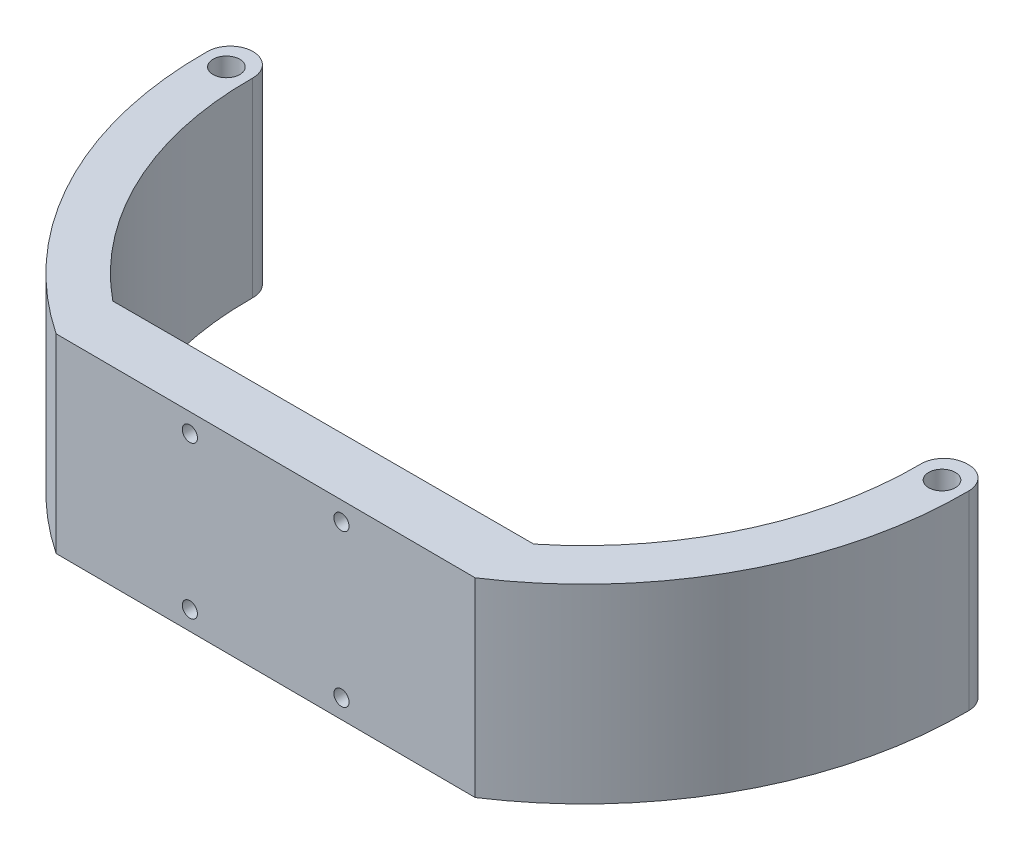
ISO-10303-21;
HEADER;
FILE_DESCRIPTION(('STEP AP214'),'2;1');
FILE_NAME('part.step','',(''),(''),'','','');
FILE_SCHEMA(('AUTOMOTIVE_DESIGN { 1 0 10303 214 1 1 1 1 }'));
ENDSEC;
DATA;
#1=APPLICATION_CONTEXT('core data for automotive mechanical design processes');
#2=APPLICATION_PROTOCOL_DEFINITION('international standard','automotive_design',2000,#1);
#3=PRODUCT_CONTEXT('',#1,'mechanical');
#4=PRODUCT('Part','Part','',(#3));
#5=PRODUCT_RELATED_PRODUCT_CATEGORY('part','',(#4));
#6=PRODUCT_DEFINITION_FORMATION('','',#4);
#7=PRODUCT_DEFINITION_CONTEXT('part definition',#1,'design');
#8=PRODUCT_DEFINITION('design','',#6,#7);
#9=PRODUCT_DEFINITION_SHAPE('','',#8);
#10=(LENGTH_UNIT() NAMED_UNIT(*) SI_UNIT(.MILLI.,.METRE.));
#11=(NAMED_UNIT(*) PLANE_ANGLE_UNIT() SI_UNIT($,.RADIAN.));
#12=(NAMED_UNIT(*) SI_UNIT($,.STERADIAN.) SOLID_ANGLE_UNIT());
#13=UNCERTAINTY_MEASURE_WITH_UNIT(LENGTH_MEASURE(1.E-05),#10,'distance_accuracy_value','');
#14=(GEOMETRIC_REPRESENTATION_CONTEXT(3) GLOBAL_UNCERTAINTY_ASSIGNED_CONTEXT((#13)) GLOBAL_UNIT_ASSIGNED_CONTEXT((#10,
#11,#12)) REPRESENTATION_CONTEXT('',''));
#15=CARTESIAN_POINT('',(0.,0.,0.));
#16=DIRECTION('',(0.,0.,1.));
#17=DIRECTION('',(1.,0.,0.));
#18=AXIS2_PLACEMENT_3D('',#15,#16,#17);
#19=CARTESIAN_POINT('',(0.,25.,0.));
#20=DIRECTION('',(0.,-1.,0.));
#21=DIRECTION('',(0.,0.,-1.));
#22=AXIS2_PLACEMENT_3D('',#19,#20,#21);
#23=PLANE('',#22);
#24=CARTESIAN_POINT('',(-47.0061393256436,25.,-0.495695011252922));
#25=DIRECTION('',(0.,-1.,0.));
#26=DIRECTION('',(0.,0.,-1.));
#27=AXIS2_PLACEMENT_3D('',#24,#25,#26);
#28=CIRCLE('',#27,3.);
#29=CARTESIAN_POINT('',(-44.0063061175485,25.,-0.46406079544247));
#30=VERTEX_POINT('',#29);
#31=CARTESIAN_POINT('',(-46.7528286740868,25.,-3.48498150033487));
#32=VERTEX_POINT('',#31);
#33=EDGE_CURVE('E214',#30,#32,#28,.F.);
#34=ORIENTED_EDGE('',*,*,#33,.T.);
#35=CARTESIAN_POINT('',(-46.9973936285744,25.,-0.494966787488694));
#36=DIRECTION('',(0.,-1.,0.));
#37=DIRECTION('',(0.,0.,-1.));
#38=AXIS2_PLACEMENT_3D('',#35,#36,#37);
#39=CIRCLE('',#38,3.);
#40=CARTESIAN_POINT('',(-49.997227264441,25.,-0.526560412222016));
#41=VERTEX_POINT('',#40);
#42=EDGE_CURVE('E11',#32,#41,#39,.F.);
#43=ORIENTED_EDGE('',*,*,#42,.T.);
#44=CARTESIAN_POINT('',(0.,25.,0.));
#45=DIRECTION('',(0.,1.,0.));
#46=DIRECTION('',(0.,0.,-1.));
#47=AXIS2_PLACEMENT_3D('',#44,#45,#46);
#48=CIRCLE('',#47,49.9999999999988);
#49=CARTESIAN_POINT('',(-27.8216921947987,25.,41.5445958389025));
#50=VERTEX_POINT('',#49);
#51=EDGE_CURVE('E120',#41,#50,#48,.T.);
#52=ORIENTED_EDGE('',*,*,#51,.T.);
#53=DIRECTION('',(0.999990762966052,0.,0.00429813710509524));
#54=VECTOR('',#53,1.);
#55=CARTESIAN_POINT('',(-27.8216921947987,25.,41.5445958389025));
#56=LINE('',#55,#54);
#57=CARTESIAN_POINT('',(27.4635388009126,25.,41.7822215365656));
#58=VERTEX_POINT('',#57);
#59=EDGE_CURVE('E125',#50,#58,#56,.T.);
#60=ORIENTED_EDGE('',*,*,#59,.T.);
#61=CARTESIAN_POINT('',(0.,25.,0.));
#62=DIRECTION('',(0.,1.,0.));
#63=DIRECTION('',(0.,0.,1.));
#64=AXIS2_PLACEMENT_3D('',#61,#62,#63);
#65=CIRCLE('',#64,49.9999999999988);
#66=CARTESIAN_POINT('',(49.9972274086436,25.,-0.526546719910586));
#67=VERTEX_POINT('',#66);
#68=EDGE_CURVE('E146',#58,#67,#65,.T.);
#69=ORIENTED_EDGE('',*,*,#68,.T.);
#70=CARTESIAN_POINT('',(46.9973937641249,25.,-0.49495391671595));
#71=DIRECTION('',(0.,-1.,0.));
#72=DIRECTION('',(0.,0.,-1.));
#73=AXIS2_PLACEMENT_3D('',#70,#71,#72);
#74=CIRCLE('',#73,3.);
#75=CARTESIAN_POINT('',(46.7440831125681,25.,-3.48424040579789));
#76=VERTEX_POINT('',#75);
#77=EDGE_CURVE('E220',#67,#76,#74,.F.);
#78=ORIENTED_EDGE('',*,*,#77,.T.);
#79=DIRECTION('',(-0.996428829693982,0.,0.0844368838522697));
#80=VECTOR('',#79,1.);
#81=CARTESIAN_POINT('',(49.859310291825,25.,-3.74822320885381));
#82=LINE('',#81,#80);
#83=CARTESIAN_POINT('',(46.5274746022037,25.,-3.46588510827336));
#84=VERTEX_POINT('',#83);
#85=EDGE_CURVE('E149',#76,#84,#82,.T.);
#86=ORIENTED_EDGE('',*,*,#85,.T.);
#87=CARTESIAN_POINT('',(46.7807852537605,25.,-0.476598619191415));
#88=DIRECTION('',(0.,-1.,0.));
#89=DIRECTION('',(0.,0.,-1.));
#90=AXIS2_PLACEMENT_3D('',#87,#88,#89);
#91=CIRCLE('',#90,3.);
#92=CARTESIAN_POINT('',(43.7809409320307,25.,-0.446036463088858));
#93=VERTEX_POINT('',#92);
#94=EDGE_CURVE('E217',#84,#93,#91,.F.);
#95=ORIENTED_EDGE('',*,*,#94,.T.);
#96=CARTESIAN_POINT('',(0.,25.,0.));
#97=DIRECTION('',(0.,-1.,0.));
#98=DIRECTION('',(0.,0.,1.));
#99=AXIS2_PLACEMENT_3D('',#96,#97,#98);
#100=CIRCLE('',#99,43.7832129636504);
#101=CARTESIAN_POINT('',(27.4635388009126,25.,34.098735664994));
#102=VERTEX_POINT('',#101);
#103=EDGE_CURVE('E156',#93,#102,#100,.T.);
#104=ORIENTED_EDGE('',*,*,#103,.T.);
#105=DIRECTION('',(-1.,0.,0.));
#106=VECTOR('',#105,1.);
#107=CARTESIAN_POINT('',(-27.8216921947987,25.,34.098735664994));
#108=LINE('',#107,#106);
#109=CARTESIAN_POINT('',(-27.8216921947987,25.,34.098735664994));
#110=VERTEX_POINT('',#109);
#111=EDGE_CURVE('E159',#102,#110,#108,.T.);
#112=ORIENTED_EDGE('',*,*,#111,.T.);
#113=CARTESIAN_POINT('',(0.,25.,0.));
#114=DIRECTION('',(0.,-1.,0.));
#115=DIRECTION('',(0.,0.,-1.));
#116=AXIS2_PLACEMENT_3D('',#113,#114,#115);
#117=CIRCLE('',#116,44.0087528854574);
#118=EDGE_CURVE('E129',#110,#30,#117,.T.);
#119=ORIENTED_EDGE('',*,*,#118,.T.);
#120=EDGE_LOOP('',(#34,#43,#52,#60,#69,#78,#86,#95,#104,#112,#119));
#121=FACE_BOUND('',#120,.T.);
#122=CARTESIAN_POINT('',(-47.,25.,0.));
#123=DIRECTION('',(0.,1.,0.));
#124=DIRECTION('',(0.,0.,1.));
#125=AXIS2_PLACEMENT_3D('',#122,#123,#124);
#126=CIRCLE('',#125,1.75);
#127=CARTESIAN_POINT('',(-47.,25.,1.75));
#128=VERTEX_POINT('',#127);
#129=EDGE_CURVE('E167',#128,#128,#126,.T.);
#130=ORIENTED_EDGE('',*,*,#129,.F.);
#131=EDGE_LOOP('',(#130));
#132=FACE_BOUND('',#131,.T.);
#133=CARTESIAN_POINT('',(47.,25.,0.));
#134=DIRECTION('',(0.,1.,0.));
#135=DIRECTION('',(0.,0.,-1.));
#136=AXIS2_PLACEMENT_3D('',#133,#134,#135);
#137=CIRCLE('',#136,1.750000000002);
#138=CARTESIAN_POINT('',(47.,25.,-1.75000000000202));
#139=VERTEX_POINT('',#138);
#140=EDGE_CURVE('E258',#139,#139,#137,.T.);
#141=ORIENTED_EDGE('',*,*,#140,.F.);
#142=EDGE_LOOP('',(#141));
#143=FACE_BOUND('',#142,.T.);
#144=ADVANCED_FACE('F39',(#121,#132,#143),#23,.F.);
#145=CARTESIAN_POINT('',(0.,0.,0.));
#146=DIRECTION('',(0.,-1.,0.));
#147=DIRECTION('',(0.,0.,-1.));
#148=AXIS2_PLACEMENT_3D('',#145,#146,#147);
#149=PLANE('',#148);
#150=CARTESIAN_POINT('',(-47.,0.,0.));
#151=DIRECTION('',(0.,1.,0.));
#152=DIRECTION('',(0.,0.,1.));
#153=AXIS2_PLACEMENT_3D('',#150,#151,#152);
#154=CIRCLE('',#153,1.75);
#155=CARTESIAN_POINT('',(-47.,0.,1.75));
#156=VERTEX_POINT('',#155);
#157=EDGE_CURVE('E264',#156,#156,#154,.T.);
#158=ORIENTED_EDGE('',*,*,#157,.T.);
#159=EDGE_LOOP('',(#158));
#160=FACE_BOUND('',#159,.T.);
#161=CARTESIAN_POINT('',(0.,0.,0.));
#162=DIRECTION('',(0.,1.,0.));
#163=DIRECTION('',(0.,0.,-1.));
#164=AXIS2_PLACEMENT_3D('',#161,#162,#163);
#165=CIRCLE('',#164,49.9999999999988);
#166=CARTESIAN_POINT('',(-49.997227264441,0.,-0.526560412222016));
#167=VERTEX_POINT('',#166);
#168=CARTESIAN_POINT('',(-27.8216921947987,0.,41.5445958389025));
#169=VERTEX_POINT('',#168);
#170=EDGE_CURVE('E135',#167,#169,#165,.T.);
#171=ORIENTED_EDGE('',*,*,#170,.F.);
#172=CARTESIAN_POINT('',(-46.9973936285744,0.,-0.494966787488694));
#173=DIRECTION('',(0.,-1.,0.));
#174=DIRECTION('',(0.,0.,-1.));
#175=AXIS2_PLACEMENT_3D('',#172,#173,#174);
#176=CIRCLE('',#175,3.);
#177=CARTESIAN_POINT('',(-46.7528286740868,0.,-3.48498150033487));
#178=VERTEX_POINT('',#177);
#179=EDGE_CURVE('E49',#167,#178,#176,.T.);
#180=ORIENTED_EDGE('',*,*,#179,.T.);
#181=CARTESIAN_POINT('',(-47.0061393256436,0.,-0.495695011252922));
#182=DIRECTION('',(0.,-1.,0.));
#183=DIRECTION('',(0.,0.,-1.));
#184=AXIS2_PLACEMENT_3D('',#181,#182,#183);
#185=CIRCLE('',#184,3.);
#186=CARTESIAN_POINT('',(-44.0063061175485,0.,-0.46406079544247));
#187=VERTEX_POINT('',#186);
#188=EDGE_CURVE('E202',#178,#187,#185,.T.);
#189=ORIENTED_EDGE('',*,*,#188,.T.);
#190=CARTESIAN_POINT('',(0.,0.,0.));
#191=DIRECTION('',(0.,-1.,0.));
#192=DIRECTION('',(0.,0.,-1.));
#193=AXIS2_PLACEMENT_3D('',#190,#191,#192);
#194=CIRCLE('',#193,44.0087528854574);
#195=CARTESIAN_POINT('',(-27.8216921947987,0.,34.098735664994));
#196=VERTEX_POINT('',#195);
#197=EDGE_CURVE('E163',#196,#187,#194,.T.);
#198=ORIENTED_EDGE('',*,*,#197,.F.);
#199=DIRECTION('',(-1.,0.,0.));
#200=VECTOR('',#199,1.);
#201=CARTESIAN_POINT('',(-27.8216921947987,0.,34.098735664994));
#202=LINE('',#201,#200);
#203=CARTESIAN_POINT('',(27.4635388009126,0.,34.098735664994));
#204=VERTEX_POINT('',#203);
#205=EDGE_CURVE('E184',#204,#196,#202,.T.);
#206=ORIENTED_EDGE('',*,*,#205,.F.);
#207=CARTESIAN_POINT('',(0.,0.,0.));
#208=DIRECTION('',(0.,-1.,0.));
#209=DIRECTION('',(0.,0.,1.));
#210=AXIS2_PLACEMENT_3D('',#207,#208,#209);
#211=CIRCLE('',#210,43.7832129636504);
#212=CARTESIAN_POINT('',(43.7809409320307,0.,-0.446036463088858));
#213=VERTEX_POINT('',#212);
#214=EDGE_CURVE('E181',#213,#204,#211,.T.);
#215=ORIENTED_EDGE('',*,*,#214,.F.);
#216=CARTESIAN_POINT('',(46.7807852537605,0.,-0.476598619191415));
#217=DIRECTION('',(0.,-1.,0.));
#218=DIRECTION('',(0.,0.,-1.));
#219=AXIS2_PLACEMENT_3D('',#216,#217,#218);
#220=CIRCLE('',#219,3.);
#221=CARTESIAN_POINT('',(46.5274746022037,0.,-3.46588510827336));
#222=VERTEX_POINT('',#221);
#223=EDGE_CURVE('E205',#213,#222,#220,.T.);
#224=ORIENTED_EDGE('',*,*,#223,.T.);
#225=DIRECTION('',(-0.996428829693982,0.,0.0844368838522697));
#226=VECTOR('',#225,1.);
#227=CARTESIAN_POINT('',(49.859310291825,0.,-3.74822320885381));
#228=LINE('',#227,#226);
#229=CARTESIAN_POINT('',(46.7440831125681,0.,-3.48424040579789));
#230=VERTEX_POINT('',#229);
#231=EDGE_CURVE('E177',#230,#222,#228,.T.);
#232=ORIENTED_EDGE('',*,*,#231,.F.);
#233=CARTESIAN_POINT('',(46.9973937641249,0.,-0.49495391671595));
#234=DIRECTION('',(0.,-1.,0.));
#235=DIRECTION('',(0.,0.,-1.));
#236=AXIS2_PLACEMENT_3D('',#233,#234,#235);
#237=CIRCLE('',#236,3.);
#238=CARTESIAN_POINT('',(49.9972274086436,0.,-0.526546719910586));
#239=VERTEX_POINT('',#238);
#240=EDGE_CURVE('E208',#230,#239,#237,.T.);
#241=ORIENTED_EDGE('',*,*,#240,.T.);
#242=CARTESIAN_POINT('',(0.,0.,0.));
#243=DIRECTION('',(0.,1.,0.));
#244=DIRECTION('',(0.,0.,1.));
#245=AXIS2_PLACEMENT_3D('',#242,#243,#244);
#246=CIRCLE('',#245,49.9999999999988);
#247=CARTESIAN_POINT('',(27.4635388009126,0.,41.7822215365656));
#248=VERTEX_POINT('',#247);
#249=EDGE_CURVE('E173',#248,#239,#246,.T.);
#250=ORIENTED_EDGE('',*,*,#249,.F.);
#251=DIRECTION('',(0.999990762966052,0.,0.00429813710509524));
#252=VECTOR('',#251,1.);
#253=CARTESIAN_POINT('',(-27.8216921947987,0.,41.5445958389025));
#254=LINE('',#253,#252);
#255=EDGE_CURVE('E170',#169,#248,#254,.T.);
#256=ORIENTED_EDGE('',*,*,#255,.F.);
#257=EDGE_LOOP('',(#171,#180,#189,#198,#206,#215,#224,#232,#241,#250,#256));
#258=FACE_BOUND('',#257,.T.);
#259=CARTESIAN_POINT('',(47.,0.,0.));
#260=DIRECTION('',(0.,1.,0.));
#261=DIRECTION('',(0.,0.,-1.));
#262=AXIS2_PLACEMENT_3D('',#259,#260,#261);
#263=CIRCLE('',#262,1.750000000002);
#264=CARTESIAN_POINT('',(47.,0.,-1.75000000000202));
#265=VERTEX_POINT('',#264);
#266=EDGE_CURVE('E253',#265,#265,#263,.T.);
#267=ORIENTED_EDGE('',*,*,#266,.T.);
#268=EDGE_LOOP('',(#267));
#269=FACE_BOUND('',#268,.T.);
#270=ADVANCED_FACE('F286',(#160,#258,#269),#149,.T.);
#271=CARTESIAN_POINT('',(0.,25.,0.));
#272=DIRECTION('',(0.,-1.,0.));
#273=DIRECTION('',(0.,0.,-1.));
#274=AXIS2_PLACEMENT_3D('',#271,#272,#273);
#275=CYLINDRICAL_SURFACE('',#274,44.0087528854574);
#276=ORIENTED_EDGE('',*,*,#197,.T.);
#277=DIRECTION('',(0.,-1.,0.));
#278=VECTOR('',#277,1.);
#279=CARTESIAN_POINT('',(-44.0063061175485,25.,-0.46406079544247));
#280=LINE('',#279,#278);
#281=EDGE_CURVE('E230',#187,#30,#280,.F.);
#282=ORIENTED_EDGE('',*,*,#281,.T.);
#283=ORIENTED_EDGE('',*,*,#118,.F.);
#284=DIRECTION('',(0.,-1.,0.));
#285=VECTOR('',#284,1.);
#286=CARTESIAN_POINT('',(-27.8216921947987,25.,34.098735664994));
#287=LINE('',#286,#285);
#288=EDGE_CURVE('E162',#110,#196,#287,.T.);
#289=ORIENTED_EDGE('',*,*,#288,.T.);
#290=EDGE_LOOP('',(#276,#282,#283,#289));
#291=FACE_BOUND('',#290,.T.);
#292=ADVANCED_FACE('F313',(#291),#275,.F.);
#293=CARTESIAN_POINT('',(0.,25.,0.));
#294=DIRECTION('',(0.,-1.,0.));
#295=DIRECTION('',(0.,0.,-1.));
#296=AXIS2_PLACEMENT_3D('',#293,#294,#295);
#297=CYLINDRICAL_SURFACE('',#296,49.9999999999988);
#298=ORIENTED_EDGE('',*,*,#51,.F.);
#299=DIRECTION('',(0.,-1.,0.));
#300=VECTOR('',#299,1.);
#301=CARTESIAN_POINT('',(-49.997227264441,25.,-0.526560412222016));
#302=LINE('',#301,#300);
#303=EDGE_CURVE('E233',#41,#167,#302,.T.);
#304=ORIENTED_EDGE('',*,*,#303,.T.);
#305=ORIENTED_EDGE('',*,*,#170,.T.);
#306=DIRECTION('',(0.,-1.,0.));
#307=VECTOR('',#306,1.);
#308=CARTESIAN_POINT('',(-27.8216921947987,25.,41.5445958389025));
#309=LINE('',#308,#307);
#310=EDGE_CURVE('E132',#50,#169,#309,.T.);
#311=ORIENTED_EDGE('',*,*,#310,.F.);
#312=EDGE_LOOP('',(#298,#304,#305,#311));
#313=FACE_BOUND('',#312,.T.);
#314=ADVANCED_FACE('F133',(#313),#297,.T.);
#315=CARTESIAN_POINT('',(-27.8216921947987,25.,41.5445958389025));
#316=DIRECTION('',(0.00429813710509524,0.,-0.999990762966051));
#317=DIRECTION('',(-0.999990762966052,0.,-0.00429813710509524));
#318=AXIS2_PLACEMENT_3D('',#315,#316,#317);
#319=PLANE('',#318);
#320=CARTESIAN_POINT('',(-10.1789843266035,2.5,41.6204273166831));
#321=DIRECTION('',(-0.00429813710509524,0.,0.999990762966052));
#322=DIRECTION('',(0.999990762966052,0.,0.00429813710509524));
#323=AXIS2_PLACEMENT_3D('',#320,#321,#322);
#324=CIRCLE('',#323,1.);
#325=CARTESIAN_POINT('',(-9.17899356363749,2.5,41.6247254537882));
#326=VERTEX_POINT('',#325);
#327=EDGE_CURVE('E347',#326,#326,#324,.T.);
#328=ORIENTED_EDGE('',*,*,#327,.F.);
#329=EDGE_LOOP('',(#328));
#330=FACE_BOUND('',#329,.T.);
#331=CARTESIAN_POINT('',(9.82083093271749,22.5,41.706390058785));
#332=DIRECTION('',(-0.00429813710509524,0.,0.999990762966052));
#333=DIRECTION('',(0.999990762966052,0.,0.00429813710509524));
#334=AXIS2_PLACEMENT_3D('',#331,#332,#333);
#335=CIRCLE('',#334,1.);
#336=CARTESIAN_POINT('',(10.8208216956835,22.5,41.7106881958901));
#337=VERTEX_POINT('',#336);
#338=EDGE_CURVE('E351',#337,#337,#335,.T.);
#339=ORIENTED_EDGE('',*,*,#338,.F.);
#340=EDGE_LOOP('',(#339));
#341=FACE_BOUND('',#340,.T.);
#342=CARTESIAN_POINT('',(-10.1789843266035,22.5,41.6204273166831));
#343=DIRECTION('',(-0.00429813710509524,0.,0.999990762966052));
#344=DIRECTION('',(0.999990762966052,0.,0.00429813710509524));
#345=AXIS2_PLACEMENT_3D('',#342,#343,#344);
#346=CIRCLE('',#345,1.);
#347=CARTESIAN_POINT('',(-9.17899356363749,22.5,41.6247254537882));
#348=VERTEX_POINT('',#347);
#349=EDGE_CURVE('E355',#348,#348,#346,.T.);
#350=ORIENTED_EDGE('',*,*,#349,.F.);
#351=EDGE_LOOP('',(#350));
#352=FACE_BOUND('',#351,.T.);
#353=CARTESIAN_POINT('',(9.82083093271749,2.50000000000001,41.706390058785));
#354=DIRECTION('',(-0.00429813710509524,0.,0.999990762966052));
#355=DIRECTION('',(0.999990762966052,0.,0.00429813710509524));
#356=AXIS2_PLACEMENT_3D('',#353,#354,#355);
#357=CIRCLE('',#356,1.);
#358=CARTESIAN_POINT('',(10.8208216956835,2.50000000000001,41.7106881958901));
#359=VERTEX_POINT('',#358);
#360=EDGE_CURVE('E243',#359,#359,#357,.T.);
#361=ORIENTED_EDGE('',*,*,#360,.F.);
#362=EDGE_LOOP('',(#361));
#363=FACE_BOUND('',#362,.T.);
#364=ORIENTED_EDGE('',*,*,#255,.T.);
#365=DIRECTION('',(0.,-1.,0.));
#366=VECTOR('',#365,1.);
#367=CARTESIAN_POINT('',(27.4635388009126,25.,41.7822215365656));
#368=LINE('',#367,#366);
#369=EDGE_CURVE('E140',#58,#248,#368,.T.);
#370=ORIENTED_EDGE('',*,*,#369,.F.);
#371=ORIENTED_EDGE('',*,*,#59,.F.);
#372=ORIENTED_EDGE('',*,*,#310,.T.);
#373=EDGE_LOOP('',(#364,#370,#371,#372));
#374=FACE_BOUND('',#373,.T.);
#375=ADVANCED_FACE('F142',(#330,#341,#352,#363,#374),#319,.F.);
#376=CARTESIAN_POINT('',(0.,25.,0.));
#377=DIRECTION('',(0.,-1.,0.));
#378=DIRECTION('',(0.,0.,-1.));
#379=AXIS2_PLACEMENT_3D('',#376,#377,#378);
#380=CYLINDRICAL_SURFACE('',#379,49.9999999999988);
#381=ORIENTED_EDGE('',*,*,#249,.T.);
#382=DIRECTION('',(0.,-1.,0.));
#383=VECTOR('',#382,1.);
#384=CARTESIAN_POINT('',(49.9972274086436,25.,-0.526546719910586));
#385=LINE('',#384,#383);
#386=EDGE_CURVE('E211',#239,#67,#385,.F.);
#387=ORIENTED_EDGE('',*,*,#386,.T.);
#388=ORIENTED_EDGE('',*,*,#68,.F.);
#389=ORIENTED_EDGE('',*,*,#369,.T.);
#390=EDGE_LOOP('',(#381,#387,#388,#389));
#391=FACE_BOUND('',#390,.T.);
#392=ADVANCED_FACE('F289',(#391),#380,.T.);
#393=CARTESIAN_POINT('',(49.859310291825,25.,-3.74822320885381));
#394=DIRECTION('',(0.0844368838522697,0.,0.996428829693982));
#395=DIRECTION('',(0.996428829693982,0.,-0.0844368838522697));
#396=AXIS2_PLACEMENT_3D('',#393,#394,#395);
#397=PLANE('',#396);
#398=ORIENTED_EDGE('',*,*,#85,.F.);
#399=DIRECTION('',(0.,-1.,0.));
#400=VECTOR('',#399,1.);
#401=CARTESIAN_POINT('',(46.7440831125681,25.,-3.48424040579789));
#402=LINE('',#401,#400);
#403=EDGE_CURVE('E198',#76,#230,#402,.T.);
#404=ORIENTED_EDGE('',*,*,#403,.T.);
#405=ORIENTED_EDGE('',*,*,#231,.T.);
#406=DIRECTION('',(0.,-1.,0.));
#407=VECTOR('',#406,1.);
#408=CARTESIAN_POINT('',(46.5274746022037,25.,-3.46588510827336));
#409=LINE('',#408,#407);
#410=EDGE_CURVE('E139',#222,#84,#409,.F.);
#411=ORIENTED_EDGE('',*,*,#410,.T.);
#412=EDGE_LOOP('',(#398,#404,#405,#411));
#413=FACE_BOUND('',#412,.T.);
#414=ADVANCED_FACE('F298',(#413),#397,.F.);
#415=CARTESIAN_POINT('',(0.,25.,0.));
#416=DIRECTION('',(0.,-1.,0.));
#417=DIRECTION('',(0.,0.,-1.));
#418=AXIS2_PLACEMENT_3D('',#415,#416,#417);
#419=CYLINDRICAL_SURFACE('',#418,43.7832129636504);
#420=ORIENTED_EDGE('',*,*,#103,.F.);
#421=DIRECTION('',(0.,-1.,0.));
#422=VECTOR('',#421,1.);
#423=CARTESIAN_POINT('',(43.7809409320307,25.,-0.446036463088858));
#424=LINE('',#423,#422);
#425=EDGE_CURVE('E223',#93,#213,#424,.T.);
#426=ORIENTED_EDGE('',*,*,#425,.T.);
#427=ORIENTED_EDGE('',*,*,#214,.T.);
#428=DIRECTION('',(0.,-1.,0.));
#429=VECTOR('',#428,1.);
#430=CARTESIAN_POINT('',(27.4635388009126,25.,34.098735664994));
#431=LINE('',#430,#429);
#432=EDGE_CURVE('E190',#102,#204,#431,.T.);
#433=ORIENTED_EDGE('',*,*,#432,.F.);
#434=EDGE_LOOP('',(#420,#426,#427,#433));
#435=FACE_BOUND('',#434,.T.);
#436=ADVANCED_FACE('F308',(#435),#419,.F.);
#437=CARTESIAN_POINT('',(-27.8216921947987,25.,34.098735664994));
#438=DIRECTION('',(0.,0.,1.));
#439=DIRECTION('',(1.,0.,0.));
#440=AXIS2_PLACEMENT_3D('',#437,#438,#439);
#441=PLANE('',#440);
#442=CARTESIAN_POINT('',(-10.1466547659931,2.5,34.098735664994));
#443=DIRECTION('',(0.,0.,1.));
#444=DIRECTION('',(-1.,0.,0.));
#445=AXIS2_PLACEMENT_3D('',#442,#443,#444);
#446=ELLIPSE('',#445,1.00000923711927,1.);
#447=CARTESIAN_POINT('',(-11.1466640031124,2.5,34.098735664994));
#448=VERTEX_POINT('',#447);
#449=EDGE_CURVE('E43',#448,#448,#446,.T.);
#450=ORIENTED_EDGE('',*,*,#449,.T.);
#451=EDGE_LOOP('',(#450));
#452=FACE_BOUND('',#451,.T.);
#453=CARTESIAN_POINT('',(9.85352997639236,22.5,34.098735664994));
#454=DIRECTION('',(0.,0.,1.));
#455=DIRECTION('',(-1.,0.,0.));
#456=AXIS2_PLACEMENT_3D('',#453,#454,#455);
#457=ELLIPSE('',#456,1.00000923711927,1.);
#458=CARTESIAN_POINT('',(8.85352073927309,22.5,34.098735664994));
#459=VERTEX_POINT('',#458);
#460=EDGE_CURVE('E246',#459,#459,#457,.T.);
#461=ORIENTED_EDGE('',*,*,#460,.T.);
#462=EDGE_LOOP('',(#461));
#463=FACE_BOUND('',#462,.T.);
#464=CARTESIAN_POINT('',(-10.1466547659931,22.5,34.098735664994));
#465=DIRECTION('',(0.,0.,1.));
#466=DIRECTION('',(-1.,0.,0.));
#467=AXIS2_PLACEMENT_3D('',#464,#465,#466);
#468=ELLIPSE('',#467,1.00000923711927,1.);
#469=CARTESIAN_POINT('',(-11.1466640031124,22.5,34.098735664994));
#470=VERTEX_POINT('',#469);
#471=EDGE_CURVE('E242',#470,#470,#468,.T.);
#472=ORIENTED_EDGE('',*,*,#471,.T.);
#473=EDGE_LOOP('',(#472));
#474=FACE_BOUND('',#473,.T.);
#475=CARTESIAN_POINT('',(9.85352997639236,2.50000000000001,34.098735664994));
#476=DIRECTION('',(0.,0.,1.));
#477=DIRECTION('',(-1.,0.,0.));
#478=AXIS2_PLACEMENT_3D('',#475,#476,#477);
#479=ELLIPSE('',#478,1.00000923711927,1.);
#480=CARTESIAN_POINT('',(8.85352073927309,2.50000000000001,34.098735664994));
#481=VERTEX_POINT('',#480);
#482=EDGE_CURVE('E238',#481,#481,#479,.T.);
#483=ORIENTED_EDGE('',*,*,#482,.T.);
#484=EDGE_LOOP('',(#483));
#485=FACE_BOUND('',#484,.T.);
#486=ORIENTED_EDGE('',*,*,#205,.T.);
#487=ORIENTED_EDGE('',*,*,#288,.F.);
#488=ORIENTED_EDGE('',*,*,#111,.F.);
#489=ORIENTED_EDGE('',*,*,#432,.T.);
#490=EDGE_LOOP('',(#486,#487,#488,#489));
#491=FACE_BOUND('',#490,.T.);
#492=ADVANCED_FACE('F311',(#452,#463,#474,#485,#491),#441,.F.);
#493=CARTESIAN_POINT('',(-47.,25.,0.));
#494=DIRECTION('',(0.,-1.,0.));
#495=DIRECTION('',(0.,0.,-1.));
#496=AXIS2_PLACEMENT_3D('',#493,#494,#495);
#497=CYLINDRICAL_SURFACE('',#496,1.75);
#498=ORIENTED_EDGE('',*,*,#129,.T.);
#499=EDGE_LOOP('',(#498));
#500=FACE_BOUND('',#499,.T.);
#501=ORIENTED_EDGE('',*,*,#157,.F.);
#502=EDGE_LOOP('',(#501));
#503=FACE_BOUND('',#502,.T.);
#504=ADVANCED_FACE('F329',(#500,#503),#497,.F.);
#505=CARTESIAN_POINT('',(47.,25.,0.));
#506=DIRECTION('',(0.,-1.,0.));
#507=DIRECTION('',(0.,0.,-1.));
#508=AXIS2_PLACEMENT_3D('',#505,#506,#507);
#509=CYLINDRICAL_SURFACE('',#508,1.750000000002);
#510=ORIENTED_EDGE('',*,*,#140,.T.);
#511=EDGE_LOOP('',(#510));
#512=FACE_BOUND('',#511,.T.);
#513=ORIENTED_EDGE('',*,*,#266,.F.);
#514=EDGE_LOOP('',(#513));
#515=FACE_BOUND('',#514,.T.);
#516=ADVANCED_FACE('F385',(#512,#515),#509,.F.);
#517=CARTESIAN_POINT('',(46.9973937641249,25.,-0.49495391671595));
#518=DIRECTION('',(0.,-1.,0.));
#519=DIRECTION('',(0.,0.,-1.));
#520=AXIS2_PLACEMENT_3D('',#517,#518,#519);
#521=CYLINDRICAL_SURFACE('',#520,3.);
#522=ORIENTED_EDGE('',*,*,#77,.F.);
#523=ORIENTED_EDGE('',*,*,#386,.F.);
#524=ORIENTED_EDGE('',*,*,#240,.F.);
#525=ORIENTED_EDGE('',*,*,#403,.F.);
#526=EDGE_LOOP('',(#522,#523,#524,#525));
#527=FACE_BOUND('',#526,.T.);
#528=ADVANCED_FACE('F295',(#527),#521,.T.);
#529=CARTESIAN_POINT('',(46.7807852537605,25.,-0.476598619191415));
#530=DIRECTION('',(0.,-1.,0.));
#531=DIRECTION('',(0.,0.,-1.));
#532=AXIS2_PLACEMENT_3D('',#529,#530,#531);
#533=CYLINDRICAL_SURFACE('',#532,3.);
#534=ORIENTED_EDGE('',*,*,#94,.F.);
#535=ORIENTED_EDGE('',*,*,#410,.F.);
#536=ORIENTED_EDGE('',*,*,#223,.F.);
#537=ORIENTED_EDGE('',*,*,#425,.F.);
#538=EDGE_LOOP('',(#534,#535,#536,#537));
#539=FACE_BOUND('',#538,.T.);
#540=ADVANCED_FACE('F305',(#539),#533,.T.);
#541=CARTESIAN_POINT('',(-47.0061393256436,25.,-0.495695011252922));
#542=DIRECTION('',(0.,-1.,0.));
#543=DIRECTION('',(0.,0.,-1.));
#544=AXIS2_PLACEMENT_3D('',#541,#542,#543);
#545=CYLINDRICAL_SURFACE('',#544,3.);
#546=ORIENTED_EDGE('',*,*,#33,.F.);
#547=ORIENTED_EDGE('',*,*,#281,.F.);
#548=ORIENTED_EDGE('',*,*,#188,.F.);
#549=DIRECTION('',(0.,-1.,0.));
#550=VECTOR('',#549,1.);
#551=CARTESIAN_POINT('',(-46.7528286740868,25.,-3.48498150033487));
#552=LINE('',#551,#550);
#553=EDGE_CURVE('E227',#32,#178,#552,.T.);
#554=ORIENTED_EDGE('',*,*,#553,.F.);
#555=EDGE_LOOP('',(#546,#547,#548,#554));
#556=FACE_BOUND('',#555,.T.);
#557=ADVANCED_FACE('F283',(#556),#545,.T.);
#558=CARTESIAN_POINT('',(-46.9973936285744,25.,-0.494966787488694));
#559=DIRECTION('',(0.,1.,0.));
#560=DIRECTION('',(0.,0.,1.));
#561=AXIS2_PLACEMENT_3D('',#558,#559,#560);
#562=CYLINDRICAL_SURFACE('',#561,3.);
#563=ORIENTED_EDGE('',*,*,#42,.F.);
#564=ORIENTED_EDGE('',*,*,#553,.T.);
#565=ORIENTED_EDGE('',*,*,#179,.F.);
#566=ORIENTED_EDGE('',*,*,#303,.F.);
#567=EDGE_LOOP('',(#563,#564,#565,#566));
#568=FACE_BOUND('',#567,.T.);
#569=ADVANCED_FACE('F41',(#568),#562,.T.);
#570=CARTESIAN_POINT('',(9.86381230376845,2.50000000000001,31.7064824291245));
#571=DIRECTION('',(-0.00429813710509524,0.,0.999990762966052));
#572=DIRECTION('',(0.999990762966052,0.,0.00429813710509524));
#573=AXIS2_PLACEMENT_3D('',#570,#571,#572);
#574=CYLINDRICAL_SURFACE('',#573,1.);
#575=ORIENTED_EDGE('',*,*,#360,.T.);
#576=EDGE_LOOP('',(#575));
#577=FACE_BOUND('',#576,.T.);
#578=ORIENTED_EDGE('',*,*,#482,.F.);
#579=EDGE_LOOP('',(#578));
#580=FACE_BOUND('',#579,.T.);
#581=ADVANCED_FACE('F371',(#577,#580),#574,.F.);
#582=CARTESIAN_POINT('',(-10.1360029555526,22.5,31.6205196870226));
#583=DIRECTION('',(-0.00429813710509524,0.,0.999990762966052));
#584=DIRECTION('',(0.999990762966052,0.,0.00429813710509524));
#585=AXIS2_PLACEMENT_3D('',#582,#583,#584);
#586=CYLINDRICAL_SURFACE('',#585,1.);
#587=ORIENTED_EDGE('',*,*,#349,.T.);
#588=EDGE_LOOP('',(#587));
#589=FACE_BOUND('',#588,.T.);
#590=ORIENTED_EDGE('',*,*,#471,.F.);
#591=EDGE_LOOP('',(#590));
#592=FACE_BOUND('',#591,.T.);
#593=ADVANCED_FACE('F367',(#589,#592),#586,.F.);
#594=CARTESIAN_POINT('',(9.86381230376845,22.5,31.7064824291245));
#595=DIRECTION('',(-0.00429813710509524,0.,0.999990762966052));
#596=DIRECTION('',(0.999990762966052,0.,0.00429813710509524));
#597=AXIS2_PLACEMENT_3D('',#594,#595,#596);
#598=CYLINDRICAL_SURFACE('',#597,1.);
#599=ORIENTED_EDGE('',*,*,#338,.T.);
#600=EDGE_LOOP('',(#599));
#601=FACE_BOUND('',#600,.T.);
#602=ORIENTED_EDGE('',*,*,#460,.F.);
#603=EDGE_LOOP('',(#602));
#604=FACE_BOUND('',#603,.T.);
#605=ADVANCED_FACE('F370',(#601,#604),#598,.F.);
#606=CARTESIAN_POINT('',(-10.1360029555526,2.5,31.6205196870226));
#607=DIRECTION('',(-0.00429813710509524,0.,0.999990762966052));
#608=DIRECTION('',(0.999990762966052,0.,0.00429813710509524));
#609=AXIS2_PLACEMENT_3D('',#606,#607,#608);
#610=CYLINDRICAL_SURFACE('',#609,1.);
#611=ORIENTED_EDGE('',*,*,#327,.T.);
#612=EDGE_LOOP('',(#611));
#613=FACE_BOUND('',#612,.T.);
#614=ORIENTED_EDGE('',*,*,#449,.F.);
#615=EDGE_LOOP('',(#614));
#616=FACE_BOUND('',#615,.T.);
#617=ADVANCED_FACE('F473',(#613,#616),#610,.F.);
#618=CLOSED_SHELL('',(#144,#270,#292,#314,#375,#392,#414,#436,#492,#504,#516,#528,#540,#557,
#569,#581,#593,#605,#617));
#619=MANIFOLD_SOLID_BREP('B2',#618);
#620=ADVANCED_BREP_SHAPE_REPRESENTATION('',(#18,#619),#14);
#621=SHAPE_DEFINITION_REPRESENTATION(#9,#620);
ENDSEC;
END-ISO-10303-21;
